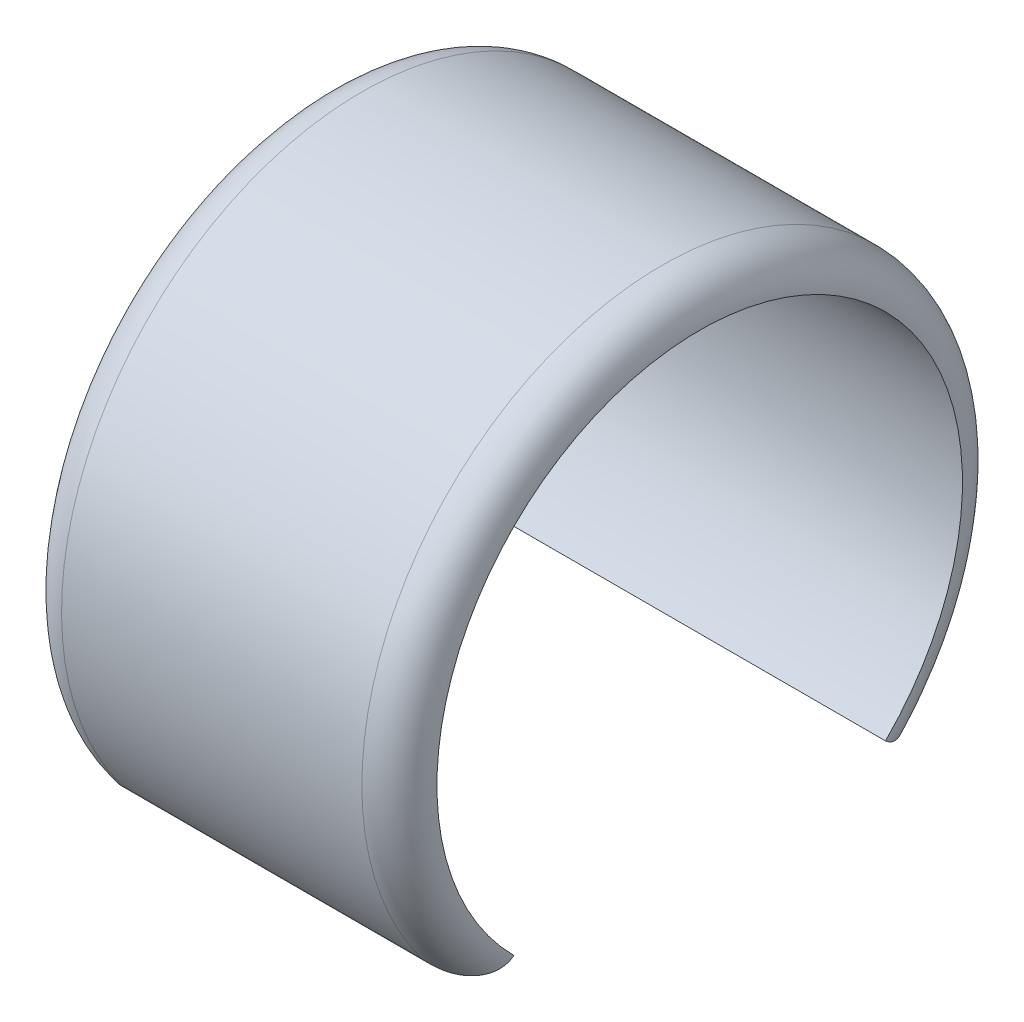
ISO-10303-21;
HEADER;
FILE_DESCRIPTION(('STEP AP214'),'2;1');
FILE_NAME('part.step','',(''),(''),'','','');
FILE_SCHEMA(('AUTOMOTIVE_DESIGN { 1 0 10303 214 1 1 1 1 }'));
ENDSEC;
DATA;
#1=APPLICATION_CONTEXT('core data for automotive mechanical design processes');
#2=APPLICATION_PROTOCOL_DEFINITION('international standard','automotive_design',2000,#1);
#3=PRODUCT_CONTEXT('',#1,'mechanical');
#4=PRODUCT('Part','Part','',(#3));
#5=PRODUCT_RELATED_PRODUCT_CATEGORY('part','',(#4));
#6=PRODUCT_DEFINITION_FORMATION('','',#4);
#7=PRODUCT_DEFINITION_CONTEXT('part definition',#1,'design');
#8=PRODUCT_DEFINITION('design','',#6,#7);
#9=PRODUCT_DEFINITION_SHAPE('','',#8);
#10=(LENGTH_UNIT() NAMED_UNIT(*) SI_UNIT(.MILLI.,.METRE.));
#11=(NAMED_UNIT(*) PLANE_ANGLE_UNIT() SI_UNIT($,.RADIAN.));
#12=(NAMED_UNIT(*) SI_UNIT($,.STERADIAN.) SOLID_ANGLE_UNIT());
#13=UNCERTAINTY_MEASURE_WITH_UNIT(LENGTH_MEASURE(1.E-05),#10,'distance_accuracy_value','');
#14=(GEOMETRIC_REPRESENTATION_CONTEXT(3) GLOBAL_UNCERTAINTY_ASSIGNED_CONTEXT((#13)) GLOBAL_UNIT_ASSIGNED_CONTEXT((#10,
#11,#12)) REPRESENTATION_CONTEXT('',''));
#15=CARTESIAN_POINT('',(0.,0.,0.));
#16=DIRECTION('',(0.,0.,1.));
#17=DIRECTION('',(1.,0.,0.));
#18=AXIS2_PLACEMENT_3D('',#15,#16,#17);
#19=CARTESIAN_POINT('',(-67.2609390769594,0.,0.));
#20=DIRECTION('',(-1.,0.,0.));
#21=DIRECTION('',(0.,0.,1.));
#22=AXIS2_PLACEMENT_3D('',#19,#20,#21);
#23=CYLINDRICAL_SURFACE('',#22,80.);
#24=CARTESIAN_POINT('',(-40.,0.,0.));
#25=DIRECTION('',(1.,0.,0.));
#26=DIRECTION('',(0.,0.,-1.));
#27=AXIS2_PLACEMENT_3D('',#24,#25,#26);
#28=CIRCLE('',#27,80.);
#29=CARTESIAN_POINT('',(-40.,-47.9307338334937,-64.0518911054372));
#30=VERTEX_POINT('',#29);
#31=CARTESIAN_POINT('',(-40.,-47.9307338334937,64.0518911054372));
#32=VERTEX_POINT('',#31);
#33=EDGE_CURVE('E54',#30,#32,#28,.T.);
#34=ORIENTED_EDGE('',*,*,#33,.T.);
#35=DIRECTION('',(-1.,0.,0.));
#36=VECTOR('',#35,1.);
#37=CARTESIAN_POINT('',(-67.2609390769594,-47.9307338334937,64.0518911054372));
#38=LINE('',#37,#36);
#39=CARTESIAN_POINT('',(40.,-47.9307338334937,64.0518911054372));
#40=VERTEX_POINT('',#39);
#41=EDGE_CURVE('E11',#32,#40,#38,.F.);
#42=ORIENTED_EDGE('',*,*,#41,.T.);
#43=CARTESIAN_POINT('',(40.,0.,0.));
#44=DIRECTION('',(-1.,0.,0.));
#45=DIRECTION('',(0.,0.,1.));
#46=AXIS2_PLACEMENT_3D('',#43,#44,#45);
#47=CIRCLE('',#46,80.);
#48=CARTESIAN_POINT('',(40.,-47.9307338334937,-64.0518911054372));
#49=VERTEX_POINT('',#48);
#50=EDGE_CURVE('E141',#40,#49,#47,.T.);
#51=ORIENTED_EDGE('',*,*,#50,.T.);
#52=DIRECTION('',(-1.,0.,0.));
#53=VECTOR('',#52,1.);
#54=CARTESIAN_POINT('',(-67.2609390769594,-47.9307338334937,-64.0518911054372));
#55=LINE('',#54,#53);
#56=EDGE_CURVE('E65',#49,#30,#55,.T.);
#57=ORIENTED_EDGE('',*,*,#56,.T.);
#58=EDGE_LOOP('',(#34,#42,#51,#57));
#59=FACE_BOUND('',#58,.T.);
#60=ADVANCED_FACE('F39',(#59),#23,.T.);
#61=CARTESIAN_POINT('',(-67.2609390769594,0.,0.));
#62=DIRECTION('',(-1.,0.,0.));
#63=DIRECTION('',(0.,0.,1.));
#64=AXIS2_PLACEMENT_3D('',#61,#62,#63);
#65=CYLINDRICAL_SURFACE('',#64,70.);
#66=DIRECTION('',(1.,0.,0.));
#67=VECTOR('',#66,1.);
#68=CARTESIAN_POINT('',(-50.,-49.4974746830586,49.4974746830581));
#69=LINE('',#68,#67);
#70=CARTESIAN_POINT('',(-50.,-49.4974746830586,49.4974746830581));
#71=VERTEX_POINT('',#70);
#72=CARTESIAN_POINT('',(50.,-49.4974746830586,49.4974746830581));
#73=VERTEX_POINT('',#72);
#74=EDGE_CURVE('E92',#71,#73,#69,.T.);
#75=ORIENTED_EDGE('',*,*,#74,.F.);
#76=CARTESIAN_POINT('',(-50.,0.,0.));
#77=DIRECTION('',(-1.,0.,0.));
#78=DIRECTION('',(0.,0.,1.));
#79=AXIS2_PLACEMENT_3D('',#76,#77,#78);
#80=CIRCLE('',#79,70.);
#81=CARTESIAN_POINT('',(-50.,-49.4974746830586,-49.4974746830581));
#82=VERTEX_POINT('',#81);
#83=EDGE_CURVE('E86',#71,#82,#80,.T.);
#84=ORIENTED_EDGE('',*,*,#83,.T.);
#85=DIRECTION('',(1.,0.,0.));
#86=VECTOR('',#85,1.);
#87=CARTESIAN_POINT('',(-50.,-49.4974746830586,-49.4974746830581));
#88=LINE('',#87,#86);
#89=CARTESIAN_POINT('',(50.,-49.4974746830586,-49.4974746830581));
#90=VERTEX_POINT('',#89);
#91=EDGE_CURVE('E89',#82,#90,#88,.T.);
#92=ORIENTED_EDGE('',*,*,#91,.T.);
#93=CARTESIAN_POINT('',(50.,0.,0.));
#94=DIRECTION('',(-1.,0.,0.));
#95=DIRECTION('',(0.,0.,1.));
#96=AXIS2_PLACEMENT_3D('',#93,#94,#95);
#97=CIRCLE('',#96,70.);
#98=EDGE_CURVE('E97',#73,#90,#97,.T.);
#99=ORIENTED_EDGE('',*,*,#98,.F.);
#100=EDGE_LOOP('',(#75,#84,#92,#99));
#101=FACE_BOUND('',#100,.T.);
#102=ADVANCED_FACE('F88',(#101),#65,.F.);
#103=CARTESIAN_POINT('',(-67.2609390769594,-41.939392104307,-56.0454047172576));
#104=DIRECTION('',(1.,0.,0.));
#105=DIRECTION('',(0.,0.,-1.));
#106=AXIS2_PLACEMENT_3D('',#103,#104,#105);
#107=CYLINDRICAL_SURFACE('',#106,10.);
#108=CARTESIAN_POINT('',(-50.,-49.4974746830586,-49.4974746830581));
#109=CARTESIAN_POINT('',(-50.0000016275386,-49.5720922872421,-49.583600958209));
#110=CARTESIAN_POINT('',(-49.9980615713119,-49.6452224027288,-49.6709911116514));
#111=CARTESIAN_POINT('',(-49.9903474935519,-49.7883709229263,-49.8481074873015));
#112=CARTESIAN_POINT('',(-49.9845737934348,-49.8583895879791,-49.9378335130617));
#113=CARTESIAN_POINT('',(-49.9615933825126,-50.0634350816123,-50.2100419314076));
#114=CARTESIAN_POINT('',(-49.938727129425,-50.193622889969,-50.3957527642506));
#115=CARTESIAN_POINT('',(-49.8788472988556,-50.4390442899782,-50.7722636010308));
#116=CARTESIAN_POINT('',(-49.8419558404736,-50.5543957746066,-50.9630068075382));
#117=CARTESIAN_POINT('',(-49.7549035319214,-50.7709854735476,-51.3494463365776));
#118=CARTESIAN_POINT('',(-49.7047402655095,-50.8722211128245,-51.5451435551556));
#119=CARTESIAN_POINT('',(-49.5923904948292,-51.0600188912606,-51.9391140492368));
#120=CARTESIAN_POINT('',(-49.5302491930476,-51.1466339698999,-52.1373751045673));
#121=CARTESIAN_POINT('',(-49.3948830546418,-51.3057639438887,-52.535828655437));
#122=CARTESIAN_POINT('',(-49.3216540974539,-51.378273574171,-52.7360218430198));
#123=CARTESIAN_POINT('',(-49.1650598726978,-51.5095665110557,-53.1374091361155));
#124=CARTESIAN_POINT('',(-49.081675248932,-51.5683229620982,-53.3386044292172));
#125=CARTESIAN_POINT('',(-48.9059179933687,-51.6723694401552,-53.7405674376768));
#126=CARTESIAN_POINT('',(-48.8135433525375,-51.7176564478877,-53.9413350471676));
#127=CARTESIAN_POINT('',(-48.5821480061174,-51.8108269120873,-54.4217424939385));
#128=CARTESIAN_POINT('',(-48.4392688217586,-51.8524783763886,-54.7007484459237));
#129=CARTESIAN_POINT('',(-48.1402505917991,-51.9119169524706,-55.2540669858063));
#130=CARTESIAN_POINT('',(-47.9841106609504,-51.9297024696984,-55.5283792588968));
#131=CARTESIAN_POINT('',(-47.6604307374939,-51.9430478431045,-56.0711873342053));
#132=CARTESIAN_POINT('',(-47.4928761691436,-51.9385787362834,-56.3396750998178));
#133=CARTESIAN_POINT('',(-47.1483411528951,-51.9089239995777,-56.8692937064185));
#134=CARTESIAN_POINT('',(-46.9713605101918,-51.8837379413885,-57.1304243951902));
#135=CARTESIAN_POINT('',(-46.5499658030172,-51.8026746010765,-57.7289815760035));
#136=CARTESIAN_POINT('',(-46.3025048553869,-51.7394312214764,-58.063279135374));
#137=CARTESIAN_POINT('',(-45.7964653252068,-51.5820848021728,-58.7158327208626));
#138=CARTESIAN_POINT('',(-45.5378831663974,-51.4879717702312,-59.0340835142474));
#139=CARTESIAN_POINT('',(-45.011692709775,-51.271506136214,-59.6536498692654));
#140=CARTESIAN_POINT('',(-44.7440744108456,-51.1491213059531,-59.9549456119428));
#141=CARTESIAN_POINT('',(-44.2020800799908,-50.878601209335,-60.539198775889));
#142=CARTESIAN_POINT('',(-43.9277047015291,-50.7304684246827,-60.8221579609135));
#143=CARTESIAN_POINT('',(-43.35490060093,-50.3996262901431,-61.3875814479487));
#144=CARTESIAN_POINT('',(-43.0561054152598,-50.2152502084034,-61.6687023665262));
#145=CARTESIAN_POINT('',(-42.4543722890501,-49.8217985485914,-62.2081363755988));
#146=CARTESIAN_POINT('',(-42.1514335018634,-49.6127178539836,-62.4664447219907));
#147=CARTESIAN_POINT('',(-41.2398864814137,-48.9522352066686,-63.2046498982149));
#148=CARTESIAN_POINT('',(-40.6266510756548,-48.4664831295725,-63.6496922483593));
#149=CARTESIAN_POINT('',(-40.0097372137289,-47.9390657685047,-64.0456511558973));
#150=CARTESIAN_POINT('',(-40.004868567349,-47.9349009854677,-64.0487727839457));
#151=CARTESIAN_POINT('',(-40.,-47.9307338334937,-64.0518911054372));
#152=B_SPLINE_CURVE_WITH_KNOTS('',3,(#108,#109,#110,#111,#112,#113,#114,#115,#116,#117,#118,
#119,#120,#121,#122,#123,#124,#125,#126,#127,#128,#129,#130,#131,#132,#133,#134,#135,#136,#137,
#138,#139,#140,#141,#142,#143,#144,#145,#146,#147,#148,#149,#150,#151),.UNSPECIFIED.,.F.,.F.,(4,
2,2,2,2,2,2,2,2,2,2,2,2,2,2,2,2,2,2,2,2,4),(0.,0.34179246103075,0.6835562694801,
1.36630110226412,2.04323251733249,2.72028725823771,3.39483527032692,4.06963458634917,
4.74574077750036,5.42199840916698,6.36925424824485,7.31657337307466,8.2651256963771,
9.21369763064604,10.4740038812505,11.7347184852808,12.9968773840974,14.2589146976894,
15.6068135407294,16.9549920360211,19.6427771422615,19.6641580450897),.UNSPECIFIED.);
#153=EDGE_CURVE('E100',#30,#82,#152,.F.);
#154=ORIENTED_EDGE('',*,*,#153,.F.);
#155=ORIENTED_EDGE('',*,*,#56,.F.);
#156=CARTESIAN_POINT('',(50.,-49.4974746830586,-49.4974746830581));
#157=CARTESIAN_POINT('',(50.0000016275386,-49.5720922872421,-49.583600958209));
#158=CARTESIAN_POINT('',(49.9980615713119,-49.6452224027288,-49.6709911116514));
#159=CARTESIAN_POINT('',(49.9903474935519,-49.7883709229263,-49.8481074873015));
#160=CARTESIAN_POINT('',(49.9845737934349,-49.8583895879791,-49.9378335130617));
#161=CARTESIAN_POINT('',(49.9615933825126,-50.0634350816123,-50.2100419314076));
#162=CARTESIAN_POINT('',(49.938727129425,-50.193622889969,-50.3957527642506));
#163=CARTESIAN_POINT('',(49.8788472988556,-50.4390442899782,-50.7722636010308));
#164=CARTESIAN_POINT('',(49.8419558404736,-50.5543957746066,-50.9630068075382));
#165=CARTESIAN_POINT('',(49.7549035319215,-50.7709854735476,-51.3494463365776));
#166=CARTESIAN_POINT('',(49.7047402655095,-50.8722211128245,-51.5451435551556));
#167=CARTESIAN_POINT('',(49.5923904948292,-51.0600188912606,-51.9391140492368));
#168=CARTESIAN_POINT('',(49.5302491930476,-51.1466339698999,-52.1373751045673));
#169=CARTESIAN_POINT('',(49.3948830546418,-51.3057639438887,-52.535828655437));
#170=CARTESIAN_POINT('',(49.321654097454,-51.378273574171,-52.7360218430198));
#171=CARTESIAN_POINT('',(49.1650598726978,-51.5095665110557,-53.1374091361155));
#172=CARTESIAN_POINT('',(49.0816752489321,-51.5683229620982,-53.3386044292172));
#173=CARTESIAN_POINT('',(48.9059179933687,-51.6723694401552,-53.7405674376768));
#174=CARTESIAN_POINT('',(48.8135433525375,-51.7176564478877,-53.9413350471676));
#175=CARTESIAN_POINT('',(48.5821480061174,-51.8108269120873,-54.4217424939385));
#176=CARTESIAN_POINT('',(48.4392688217586,-51.8524783763886,-54.7007484459237));
#177=CARTESIAN_POINT('',(48.1402505917991,-51.9119169524706,-55.2540669858063));
#178=CARTESIAN_POINT('',(47.9841106609504,-51.9297024696984,-55.5283792588968));
#179=CARTESIAN_POINT('',(47.6604307374939,-51.9430478431045,-56.0711873342053));
#180=CARTESIAN_POINT('',(47.4928761691436,-51.9385787362834,-56.3396750998178));
#181=CARTESIAN_POINT('',(47.1483411528951,-51.9089239995777,-56.8692937064185));
#182=CARTESIAN_POINT('',(46.9713605101918,-51.8837379413885,-57.1304243951902));
#183=CARTESIAN_POINT('',(46.5499658030173,-51.8026746010765,-57.7289815760035));
#184=CARTESIAN_POINT('',(46.3025048553869,-51.7394312214764,-58.063279135374));
#185=CARTESIAN_POINT('',(45.7964653252068,-51.5820848021728,-58.7158327208626));
#186=CARTESIAN_POINT('',(45.5378831663974,-51.4879717702312,-59.0340835142474));
#187=CARTESIAN_POINT('',(45.011692709775,-51.271506136214,-59.6536498692654));
#188=CARTESIAN_POINT('',(44.7440744108456,-51.1491213059531,-59.9549456119428));
#189=CARTESIAN_POINT('',(44.2020800799908,-50.878601209335,-60.539198775889));
#190=CARTESIAN_POINT('',(43.9277047015291,-50.7304684246827,-60.8221579609135));
#191=CARTESIAN_POINT('',(43.35490060093,-50.3996262901431,-61.3875814479486));
#192=CARTESIAN_POINT('',(43.0561054152598,-50.2152502084034,-61.6687023665262));
#193=CARTESIAN_POINT('',(42.4543722890501,-49.8217985485914,-62.2081363755988));
#194=CARTESIAN_POINT('',(42.1514335018634,-49.6127178539836,-62.4664447219907));
#195=CARTESIAN_POINT('',(41.2398864814137,-48.9522352066686,-63.2046498982149));
#196=CARTESIAN_POINT('',(40.6266510756548,-48.4664831295725,-63.6496922483593));
#197=CARTESIAN_POINT('',(40.0097372137289,-47.9390657685047,-64.0456511558973));
#198=CARTESIAN_POINT('',(40.004868567349,-47.9349009854677,-64.0487727839457));
#199=CARTESIAN_POINT('',(40.,-47.9307338334937,-64.0518911054372));
#200=B_SPLINE_CURVE_WITH_KNOTS('',3,(#156,#157,#158,#159,#160,#161,#162,#163,#164,#165,#166,
#167,#168,#169,#170,#171,#172,#173,#174,#175,#176,#177,#178,#179,#180,#181,#182,#183,#184,#185,
#186,#187,#188,#189,#190,#191,#192,#193,#194,#195,#196,#197,#198,#199),.UNSPECIFIED.,.F.,.F.,(4,
2,2,2,2,2,2,2,2,2,2,2,2,2,2,2,2,2,2,2,2,4),(0.,0.34179246103075,0.6835562694801,
1.36630110226412,2.04323251733249,2.72028725823771,3.39483527032692,4.06963458634917,
4.74574077750036,5.42199840916698,6.36925424824485,7.31657337307466,8.2651256963771,
9.21369763064604,10.4740038812505,11.7347184852808,12.9968773840974,14.2589146976894,
15.6068135407294,16.9549920360211,19.6427771422615,19.6641580450897),.UNSPECIFIED.);
#201=EDGE_CURVE('E44',#90,#49,#200,.T.);
#202=ORIENTED_EDGE('',*,*,#201,.F.);
#203=ORIENTED_EDGE('',*,*,#91,.F.);
#204=EDGE_LOOP('',(#154,#155,#202,#203));
#205=FACE_BOUND('',#204,.T.);
#206=ADVANCED_FACE('F41',(#205),#107,.T.);
#207=CARTESIAN_POINT('',(40.,0.,0.));
#208=DIRECTION('',(-1.,0.,0.));
#209=DIRECTION('',(0.,0.,1.));
#210=AXIS2_PLACEMENT_3D('',#207,#208,#209);
#211=TOROIDAL_SURFACE('',#210,70.,10.);
#212=ORIENTED_EDGE('',*,*,#201,.T.);
#213=ORIENTED_EDGE('',*,*,#50,.F.);
#214=CARTESIAN_POINT('',(50.,-49.4974746830586,49.4974746830581));
#215=CARTESIAN_POINT('',(50.0000016275386,-49.5720922872422,49.583600958209));
#216=CARTESIAN_POINT('',(49.9980615713119,-49.6452224027288,49.6709911116514));
#217=CARTESIAN_POINT('',(49.9903474935519,-49.7883709229263,49.8481074873015));
#218=CARTESIAN_POINT('',(49.9845737934349,-49.8583895879791,49.9378335130617));
#219=CARTESIAN_POINT('',(49.9615933825126,-50.0634350816123,50.2100419314076));
#220=CARTESIAN_POINT('',(49.938727129425,-50.193622889969,50.3957527642506));
#221=CARTESIAN_POINT('',(49.8788472988556,-50.4390442899783,50.7722636010308));
#222=CARTESIAN_POINT('',(49.8419558404736,-50.5543957746066,50.9630068075382));
#223=CARTESIAN_POINT('',(49.7549035319215,-50.7709854735476,51.3494463365776));
#224=CARTESIAN_POINT('',(49.7047402655095,-50.8722211128245,51.5451435551556));
#225=CARTESIAN_POINT('',(49.5923904948292,-51.0600188912606,51.9391140492368));
#226=CARTESIAN_POINT('',(49.5302491930476,-51.1466339698999,52.1373751045673));
#227=CARTESIAN_POINT('',(49.3948830546418,-51.3057639438888,52.535828655437));
#228=CARTESIAN_POINT('',(49.321654097454,-51.378273574171,52.7360218430198));
#229=CARTESIAN_POINT('',(49.1650598726978,-51.5095665110558,53.1374091361155));
#230=CARTESIAN_POINT('',(49.0816752489321,-51.5683229620983,53.3386044292172));
#231=CARTESIAN_POINT('',(48.9059179933687,-51.6723694401553,53.7405674376768));
#232=CARTESIAN_POINT('',(48.8135433525375,-51.7176564478877,53.9413350471676));
#233=CARTESIAN_POINT('',(48.5821480061174,-51.8108269120874,54.4217424939384));
#234=CARTESIAN_POINT('',(48.4392688217587,-51.8524783763887,54.7007484459236));
#235=CARTESIAN_POINT('',(48.1402505917991,-51.9119169524707,55.2540669858063));
#236=CARTESIAN_POINT('',(47.9841106609504,-51.9297024696984,55.5283792588967));
#237=CARTESIAN_POINT('',(47.6604307374939,-51.9430478431045,56.0711873342052));
#238=CARTESIAN_POINT('',(47.4928761691437,-51.9385787362835,56.3396750998177));
#239=CARTESIAN_POINT('',(47.1483411528951,-51.9089239995777,56.8692937064184));
#240=CARTESIAN_POINT('',(46.9713605101918,-51.8837379413885,57.1304243951902));
#241=CARTESIAN_POINT('',(46.5499658030173,-51.8026746010766,57.7289815760034));
#242=CARTESIAN_POINT('',(46.3025048553869,-51.7394312214764,58.063279135374));
#243=CARTESIAN_POINT('',(45.7964653252068,-51.5820848021728,58.7158327208626));
#244=CARTESIAN_POINT('',(45.5378831663973,-51.4879717702313,59.0340835142475));
#245=CARTESIAN_POINT('',(45.0116927097749,-51.271506136214,59.6536498692655));
#246=CARTESIAN_POINT('',(44.7440744108456,-51.1491213059531,59.9549456119429));
#247=CARTESIAN_POINT('',(44.2020800799908,-50.878601209335,60.539198775889));
#248=CARTESIAN_POINT('',(43.9277047015289,-50.7304684246829,60.8221579609134));
#249=CARTESIAN_POINT('',(43.3549006009302,-50.399626290143,61.3875814479487));
#250=CARTESIAN_POINT('',(43.0561054152606,-50.2152502084029,61.6687023665266));
#251=CARTESIAN_POINT('',(42.4543722890493,-49.821798548592,62.2081363755983));
#252=CARTESIAN_POINT('',(42.1514335018605,-49.6127178539859,62.4664447219889));
#253=CARTESIAN_POINT('',(41.2398864814196,-48.9522352066642,63.2046498982182));
#254=CARTESIAN_POINT('',(40.6266510756869,-48.4664831295486,63.6496922483774));
#255=CARTESIAN_POINT('',(40.0097372137294,-47.9390657685044,64.0456511558976));
#256=CARTESIAN_POINT('',(40.0048685673493,-47.9349009854675,64.0487727839458));
#257=CARTESIAN_POINT('',(40.,-47.9307338334937,64.0518911054372));
#258=B_SPLINE_CURVE_WITH_KNOTS('',3,(#214,#215,#216,#217,#218,#219,#220,#221,#222,#223,#224,
#225,#226,#227,#228,#229,#230,#231,#232,#233,#234,#235,#236,#237,#238,#239,#240,#241,#242,#243,
#244,#245,#246,#247,#248,#249,#250,#251,#252,#253,#254,#255,#256,#257),.UNSPECIFIED.,.F.,.F.,(4,
2,2,2,2,2,2,2,2,2,2,2,2,2,2,2,2,2,2,2,2,4),(0.,0.341792461030748,0.683556269480107,
1.36630110226411,2.04323251733248,2.72028725823771,3.39483527032693,4.06963458634918,
4.74574077750037,5.42199840916698,6.36925424824483,7.31657337307461,8.26512569637705,
9.21369763064602,10.4740038812505,11.734718485281,12.9968773840974,14.2589146976893,
15.6068135407293,16.954992036021,19.6427771422615,19.6641580450897),.UNSPECIFIED.);
#259=EDGE_CURVE('E107',#73,#40,#258,.T.);
#260=ORIENTED_EDGE('',*,*,#259,.F.);
#261=ORIENTED_EDGE('',*,*,#98,.T.);
#262=EDGE_LOOP('',(#212,#213,#260,#261));
#263=FACE_BOUND('',#262,.T.);
#264=ADVANCED_FACE('F127',(#263),#211,.T.);
#265=CARTESIAN_POINT('',(-40.,0.,0.));
#266=DIRECTION('',(1.,0.,0.));
#267=DIRECTION('',(0.,0.,-1.));
#268=AXIS2_PLACEMENT_3D('',#265,#266,#267);
#269=TOROIDAL_SURFACE('',#268,70.,10.);
#270=ORIENTED_EDGE('',*,*,#153,.T.);
#271=ORIENTED_EDGE('',*,*,#83,.F.);
#272=CARTESIAN_POINT('',(-50.,-49.4974746830586,49.4974746830581));
#273=CARTESIAN_POINT('',(-50.0000016275386,-49.5720922872422,49.583600958209));
#274=CARTESIAN_POINT('',(-49.9980615713119,-49.6452224027288,49.6709911116514));
#275=CARTESIAN_POINT('',(-49.9903474935519,-49.7883709229263,49.8481074873015));
#276=CARTESIAN_POINT('',(-49.9845737934348,-49.8583895879791,49.9378335130617));
#277=CARTESIAN_POINT('',(-49.9615933825126,-50.0634350816123,50.2100419314076));
#278=CARTESIAN_POINT('',(-49.938727129425,-50.193622889969,50.3957527642506));
#279=CARTESIAN_POINT('',(-49.8788472988556,-50.4390442899783,50.7722636010308));
#280=CARTESIAN_POINT('',(-49.8419558404736,-50.5543957746066,50.9630068075382));
#281=CARTESIAN_POINT('',(-49.7549035319214,-50.7709854735476,51.3494463365776));
#282=CARTESIAN_POINT('',(-49.7047402655095,-50.8722211128245,51.5451435551556));
#283=CARTESIAN_POINT('',(-49.5923904948292,-51.0600188912606,51.9391140492368));
#284=CARTESIAN_POINT('',(-49.5302491930476,-51.1466339698999,52.1373751045673));
#285=CARTESIAN_POINT('',(-49.3948830546418,-51.3057639438888,52.535828655437));
#286=CARTESIAN_POINT('',(-49.3216540974539,-51.378273574171,52.7360218430198));
#287=CARTESIAN_POINT('',(-49.1650598726978,-51.5095665110558,53.1374091361155));
#288=CARTESIAN_POINT('',(-49.081675248932,-51.5683229620983,53.3386044292172));
#289=CARTESIAN_POINT('',(-48.9059179933687,-51.6723694401553,53.7405674376768));
#290=CARTESIAN_POINT('',(-48.8135433525375,-51.7176564478877,53.9413350471676));
#291=CARTESIAN_POINT('',(-48.5821480061174,-51.8108269120874,54.4217424939384));
#292=CARTESIAN_POINT('',(-48.4392688217586,-51.8524783763887,54.7007484459236));
#293=CARTESIAN_POINT('',(-48.1402505917991,-51.9119169524707,55.2540669858063));
#294=CARTESIAN_POINT('',(-47.9841106609504,-51.9297024696984,55.5283792588967));
#295=CARTESIAN_POINT('',(-47.6604307374939,-51.9430478431045,56.0711873342052));
#296=CARTESIAN_POINT('',(-47.4928761691437,-51.9385787362835,56.3396750998177));
#297=CARTESIAN_POINT('',(-47.1483411528951,-51.9089239995777,56.8692937064184));
#298=CARTESIAN_POINT('',(-46.9713605101918,-51.8837379413885,57.1304243951902));
#299=CARTESIAN_POINT('',(-46.5499658030172,-51.8026746010766,57.7289815760034));
#300=CARTESIAN_POINT('',(-46.3025048553869,-51.7394312214764,58.063279135374));
#301=CARTESIAN_POINT('',(-45.7964653252068,-51.5820848021728,58.7158327208626));
#302=CARTESIAN_POINT('',(-45.5378831663973,-51.4879717702313,59.0340835142475));
#303=CARTESIAN_POINT('',(-45.0116927097749,-51.271506136214,59.6536498692655));
#304=CARTESIAN_POINT('',(-44.7440744108456,-51.1491213059531,59.9549456119429));
#305=CARTESIAN_POINT('',(-44.2020800799908,-50.878601209335,60.539198775889));
#306=CARTESIAN_POINT('',(-43.9277047015289,-50.7304684246829,60.8221579609134));
#307=CARTESIAN_POINT('',(-43.3549006009302,-50.399626290143,61.3875814479487));
#308=CARTESIAN_POINT('',(-43.0561054152606,-50.2152502084029,61.6687023665266));
#309=CARTESIAN_POINT('',(-42.4543722890493,-49.821798548592,62.2081363755983));
#310=CARTESIAN_POINT('',(-42.1514335018605,-49.6127178539859,62.4664447219889));
#311=CARTESIAN_POINT('',(-41.2398864814196,-48.9522352066642,63.2046498982182));
#312=CARTESIAN_POINT('',(-40.6266510756869,-48.4664831295486,63.6496922483774));
#313=CARTESIAN_POINT('',(-40.0097372137294,-47.9390657685044,64.0456511558976));
#314=CARTESIAN_POINT('',(-40.0048685673493,-47.9349009854675,64.0487727839458));
#315=CARTESIAN_POINT('',(-40.,-47.9307338334937,64.0518911054372));
#316=B_SPLINE_CURVE_WITH_KNOTS('',3,(#272,#273,#274,#275,#276,#277,#278,#279,#280,#281,#282,
#283,#284,#285,#286,#287,#288,#289,#290,#291,#292,#293,#294,#295,#296,#297,#298,#299,#300,#301,
#302,#303,#304,#305,#306,#307,#308,#309,#310,#311,#312,#313,#314,#315),.UNSPECIFIED.,.F.,.F.,(4,
2,2,2,2,2,2,2,2,2,2,2,2,2,2,2,2,2,2,2,2,4),(0.,0.341792461030748,0.683556269480107,
1.36630110226411,2.04323251733248,2.72028725823771,3.39483527032692,4.06963458634918,
4.74574077750036,5.42199840916698,6.36925424824483,7.31657337307461,8.26512569637705,
9.21369763064602,10.4740038812505,11.734718485281,12.9968773840974,14.2589146976893,
15.6068135407293,16.954992036021,19.6427771422615,19.6641580450897),.UNSPECIFIED.);
#317=EDGE_CURVE('E110',#32,#71,#316,.F.);
#318=ORIENTED_EDGE('',*,*,#317,.F.);
#319=ORIENTED_EDGE('',*,*,#33,.F.);
#320=EDGE_LOOP('',(#270,#271,#318,#319));
#321=FACE_BOUND('',#320,.T.);
#322=ADVANCED_FACE('F105',(#321),#269,.T.);
#323=CARTESIAN_POINT('',(-67.2609390769594,-41.939392104307,56.0454047172575));
#324=DIRECTION('',(1.,0.,0.));
#325=DIRECTION('',(0.,0.,-1.));
#326=AXIS2_PLACEMENT_3D('',#323,#324,#325);
#327=CYLINDRICAL_SURFACE('',#326,10.);
#328=ORIENTED_EDGE('',*,*,#259,.T.);
#329=ORIENTED_EDGE('',*,*,#41,.F.);
#330=ORIENTED_EDGE('',*,*,#317,.T.);
#331=ORIENTED_EDGE('',*,*,#74,.T.);
#332=EDGE_LOOP('',(#328,#329,#330,#331));
#333=FACE_BOUND('',#332,.T.);
#334=ADVANCED_FACE('F126',(#333),#327,.T.);
#335=CLOSED_SHELL('',(#60,#102,#206,#264,#322,#334));
#336=MANIFOLD_SOLID_BREP('B2',#335);
#337=ADVANCED_BREP_SHAPE_REPRESENTATION('',(#18,#336),#14);
#338=SHAPE_DEFINITION_REPRESENTATION(#9,#337);
ENDSEC;
END-ISO-10303-21;
